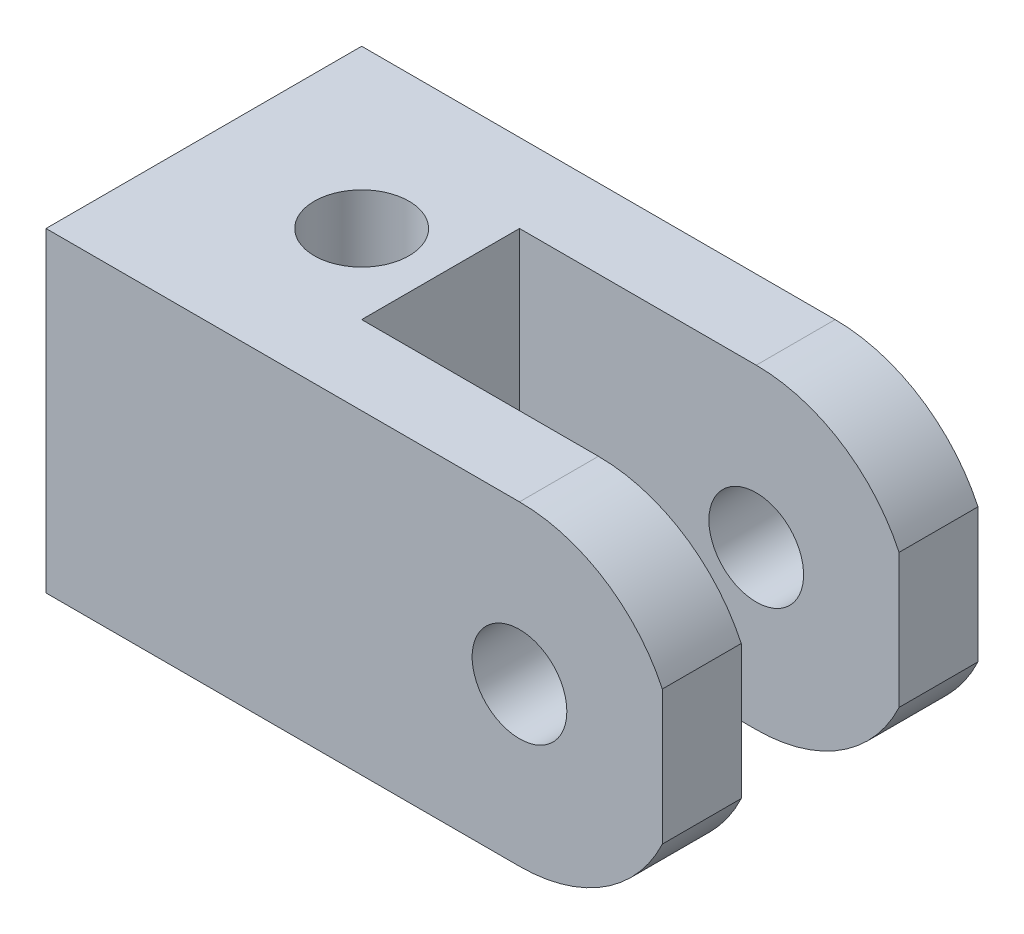
ISO-10303-21;
HEADER;
FILE_DESCRIPTION(('STEP AP214'),'2;1');
FILE_NAME('part.step','',(''),(''),'','','');
FILE_SCHEMA(('AUTOMOTIVE_DESIGN { 1 0 10303 214 1 1 1 1 }'));
ENDSEC;
DATA;
#1=APPLICATION_CONTEXT('core data for automotive mechanical design processes');
#2=APPLICATION_PROTOCOL_DEFINITION('international standard','automotive_design',2000,#1);
#3=PRODUCT_CONTEXT('',#1,'mechanical');
#4=PRODUCT('Part','Part','',(#3));
#5=PRODUCT_RELATED_PRODUCT_CATEGORY('part','',(#4));
#6=PRODUCT_DEFINITION_FORMATION('','',#4);
#7=PRODUCT_DEFINITION_CONTEXT('part definition',#1,'design');
#8=PRODUCT_DEFINITION('design','',#6,#7);
#9=PRODUCT_DEFINITION_SHAPE('','',#8);
#10=(LENGTH_UNIT() NAMED_UNIT(*) SI_UNIT(.MILLI.,.METRE.));
#11=(NAMED_UNIT(*) PLANE_ANGLE_UNIT() SI_UNIT($,.RADIAN.));
#12=(NAMED_UNIT(*) SI_UNIT($,.STERADIAN.) SOLID_ANGLE_UNIT());
#13=UNCERTAINTY_MEASURE_WITH_UNIT(LENGTH_MEASURE(1.E-05),#10,'distance_accuracy_value','');
#14=(GEOMETRIC_REPRESENTATION_CONTEXT(3) GLOBAL_UNCERTAINTY_ASSIGNED_CONTEXT((#13)) GLOBAL_UNIT_ASSIGNED_CONTEXT((#10,
#11,#12)) REPRESENTATION_CONTEXT('',''));
#15=CARTESIAN_POINT('',(0.,0.,0.));
#16=DIRECTION('',(0.,0.,1.));
#17=DIRECTION('',(1.,0.,0.));
#18=AXIS2_PLACEMENT_3D('',#15,#16,#17);
#19=CARTESIAN_POINT('',(5.,-5.,10.));
#20=DIRECTION('',(0.,1.,0.));
#21=DIRECTION('',(-1.,0.,0.));
#22=AXIS2_PLACEMENT_3D('',#19,#20,#21);
#23=PLANE('',#22);
#24=CARTESIAN_POINT('',(-10.,-5.,5.));
#25=DIRECTION('',(0.,1.,0.));
#26=DIRECTION('',(-1.,0.,0.));
#27=AXIS2_PLACEMENT_3D('',#24,#25,#26);
#28=CIRCLE('',#27,1.5);
#29=CARTESIAN_POINT('',(-11.5,-5.,5.));
#30=VERTEX_POINT('',#29);
#31=EDGE_CURVE('E196',#30,#30,#28,.T.);
#32=ORIENTED_EDGE('',*,*,#31,.T.);
#33=EDGE_LOOP('',(#32));
#34=FACE_BOUND('',#33,.T.);
#35=DIRECTION('',(0.,0.,1.));
#36=VECTOR('',#35,1.);
#37=CARTESIAN_POINT('',(0.,-5.,0.));
#38=LINE('',#37,#36);
#39=CARTESIAN_POINT('',(0.,-5.,7.5));
#40=VERTEX_POINT('',#39);
#41=CARTESIAN_POINT('',(0.,-5.,10.));
#42=VERTEX_POINT('',#41);
#43=EDGE_CURVE('E159',#40,#42,#38,.T.);
#44=ORIENTED_EDGE('',*,*,#43,.T.);
#45=DIRECTION('',(1.,0.,0.));
#46=VECTOR('',#45,1.);
#47=CARTESIAN_POINT('',(5.,-5.,10.));
#48=LINE('',#47,#46);
#49=CARTESIAN_POINT('',(-15.,-5.,10.));
#50=VERTEX_POINT('',#49);
#51=EDGE_CURVE('E210',#50,#42,#48,.T.);
#52=ORIENTED_EDGE('',*,*,#51,.F.);
#53=DIRECTION('',(0.,0.,-1.));
#54=VECTOR('',#53,1.);
#55=CARTESIAN_POINT('',(-15.,-5.,10.));
#56=LINE('',#55,#54);
#57=CARTESIAN_POINT('',(-15.,-5.,0.));
#58=VERTEX_POINT('',#57);
#59=EDGE_CURVE('E224',#50,#58,#56,.T.);
#60=ORIENTED_EDGE('',*,*,#59,.T.);
#61=DIRECTION('',(1.,0.,0.));
#62=VECTOR('',#61,1.);
#63=CARTESIAN_POINT('',(5.,-5.,0.));
#64=LINE('',#63,#62);
#65=CARTESIAN_POINT('',(0.,-5.,0.));
#66=VERTEX_POINT('',#65);
#67=EDGE_CURVE('E218',#58,#66,#64,.T.);
#68=ORIENTED_EDGE('',*,*,#67,.T.);
#69=CARTESIAN_POINT('',(0.,-5.,2.5));
#70=VERTEX_POINT('',#69);
#71=EDGE_CURVE('E156',#66,#70,#38,.T.);
#72=ORIENTED_EDGE('',*,*,#71,.T.);
#73=DIRECTION('',(1.,0.,0.));
#74=VECTOR('',#73,1.);
#75=CARTESIAN_POINT('',(-7.5,-5.,2.5));
#76=LINE('',#75,#74);
#77=CARTESIAN_POINT('',(-7.5,-5.,2.5));
#78=VERTEX_POINT('',#77);
#79=EDGE_CURVE('E188',#78,#70,#76,.T.);
#80=ORIENTED_EDGE('',*,*,#79,.F.);
#81=DIRECTION('',(0.,0.,-1.));
#82=VECTOR('',#81,1.);
#83=CARTESIAN_POINT('',(-7.5,-5.,7.5));
#84=LINE('',#83,#82);
#85=CARTESIAN_POINT('',(-7.5,-5.,7.5));
#86=VERTEX_POINT('',#85);
#87=EDGE_CURVE('E172',#86,#78,#84,.T.);
#88=ORIENTED_EDGE('',*,*,#87,.F.);
#89=DIRECTION('',(1.,0.,0.));
#90=VECTOR('',#89,1.);
#91=CARTESIAN_POINT('',(-7.5,-5.,7.5));
#92=LINE('',#91,#90);
#93=EDGE_CURVE('E180',#86,#40,#92,.T.);
#94=ORIENTED_EDGE('',*,*,#93,.T.);
#95=EDGE_LOOP('',(#44,#52,#60,#68,#72,#80,#88,#94));
#96=FACE_BOUND('',#95,.T.);
#97=ADVANCED_FACE('F33',(#34,#96),#23,.F.);
#98=CARTESIAN_POINT('',(0.,0.,10.));
#99=DIRECTION('',(0.,0.,-1.));
#100=DIRECTION('',(-1.,0.,0.));
#101=AXIS2_PLACEMENT_3D('',#98,#99,#100);
#102=CYLINDRICAL_SURFACE('',#101,1.5);
#103=CARTESIAN_POINT('',(0.,0.,7.5));
#104=DIRECTION('',(0.,0.,1.));
#105=DIRECTION('',(1.,0.,0.));
#106=AXIS2_PLACEMENT_3D('',#103,#104,#105);
#107=CIRCLE('',#106,1.5);
#108=CARTESIAN_POINT('',(1.5,0.,7.5));
#109=VERTEX_POINT('',#108);
#110=EDGE_CURVE('E197',#109,#109,#107,.T.);
#111=ORIENTED_EDGE('',*,*,#110,.F.);
#112=EDGE_LOOP('',(#111));
#113=FACE_BOUND('',#112,.T.);
#114=CARTESIAN_POINT('',(0.,0.,10.));
#115=DIRECTION('',(0.,0.,1.));
#116=DIRECTION('',(1.,0.,0.));
#117=AXIS2_PLACEMENT_3D('',#114,#115,#116);
#118=CIRCLE('',#117,1.5);
#119=CARTESIAN_POINT('',(1.5,0.,10.));
#120=VERTEX_POINT('',#119);
#121=EDGE_CURVE('E201',#120,#120,#118,.T.);
#122=ORIENTED_EDGE('',*,*,#121,.T.);
#123=EDGE_LOOP('',(#122));
#124=FACE_BOUND('',#123,.T.);
#125=ADVANCED_FACE('F279',(#113,#124),#102,.F.);
#126=CARTESIAN_POINT('',(0.,0.,10.));
#127=DIRECTION('',(0.,0.,1.));
#128=DIRECTION('',(1.,0.,0.));
#129=AXIS2_PLACEMENT_3D('',#126,#127,#128);
#130=PLANE('',#129);
#131=CARTESIAN_POINT('',(0.,0.,10.));
#132=DIRECTION('',(0.,0.,-1.));
#133=DIRECTION('',(1.,0.,0.));
#134=AXIS2_PLACEMENT_3D('',#131,#132,#133);
#135=CIRCLE('',#134,5.);
#136=CARTESIAN_POINT('',(0.,5.,10.));
#137=VERTEX_POINT('',#136);
#138=CARTESIAN_POINT('',(4.52508976466333,2.12686685566801,10.));
#139=VERTEX_POINT('',#138);
#140=EDGE_CURVE('E148',#137,#139,#135,.T.);
#141=ORIENTED_EDGE('',*,*,#140,.F.);
#142=DIRECTION('',(-1.,0.,0.));
#143=VECTOR('',#142,1.);
#144=CARTESIAN_POINT('',(5.,5.,10.));
#145=LINE('',#144,#143);
#146=CARTESIAN_POINT('',(-15.,5.,10.));
#147=VERTEX_POINT('',#146);
#148=EDGE_CURVE('E213',#137,#147,#145,.T.);
#149=ORIENTED_EDGE('',*,*,#148,.T.);
#150=DIRECTION('',(0.,-1.,0.));
#151=VECTOR('',#150,1.);
#152=CARTESIAN_POINT('',(-15.,-5.,10.));
#153=LINE('',#152,#151);
#154=EDGE_CURVE('E207',#147,#50,#153,.T.);
#155=ORIENTED_EDGE('',*,*,#154,.T.);
#156=ORIENTED_EDGE('',*,*,#51,.T.);
#157=CARTESIAN_POINT('',(0.,0.,10.));
#158=DIRECTION('',(0.,0.,-1.));
#159=DIRECTION('',(1.,0.,0.));
#160=AXIS2_PLACEMENT_3D('',#157,#158,#159);
#161=CIRCLE('',#160,5.);
#162=CARTESIAN_POINT('',(4.52508976466333,-2.12686685566801,10.));
#163=VERTEX_POINT('',#162);
#164=EDGE_CURVE('E142',#163,#42,#161,.T.);
#165=ORIENTED_EDGE('',*,*,#164,.F.);
#166=DIRECTION('',(0.,-1.,0.));
#167=VECTOR('',#166,1.);
#168=CARTESIAN_POINT('',(4.52508976466333,2.12686685566801,10.));
#169=LINE('',#168,#167);
#170=EDGE_CURVE('E144',#139,#163,#169,.T.);
#171=ORIENTED_EDGE('',*,*,#170,.F.);
#172=EDGE_LOOP('',(#141,#149,#155,#156,#165,#171));
#173=FACE_BOUND('',#172,.T.);
#174=ORIENTED_EDGE('',*,*,#121,.F.);
#175=EDGE_LOOP('',(#174));
#176=FACE_BOUND('',#175,.T.);
#177=ADVANCED_FACE('F264',(#173,#176),#130,.T.);
#178=CARTESIAN_POINT('',(0.,0.,0.));
#179=DIRECTION('',(0.,0.,1.));
#180=DIRECTION('',(1.,0.,0.));
#181=AXIS2_PLACEMENT_3D('',#178,#179,#180);
#182=PLANE('',#181);
#183=DIRECTION('',(-1.,0.,0.));
#184=VECTOR('',#183,1.);
#185=CARTESIAN_POINT('',(5.,5.,0.));
#186=LINE('',#185,#184);
#187=CARTESIAN_POINT('',(0.,5.,0.));
#188=VERTEX_POINT('',#187);
#189=CARTESIAN_POINT('',(-15.,5.,0.));
#190=VERTEX_POINT('',#189);
#191=EDGE_CURVE('E141',#188,#190,#186,.T.);
#192=ORIENTED_EDGE('',*,*,#191,.F.);
#193=CARTESIAN_POINT('',(0.,0.,0.));
#194=DIRECTION('',(0.,0.,-1.));
#195=DIRECTION('',(1.,0.,0.));
#196=AXIS2_PLACEMENT_3D('',#193,#194,#195);
#197=CIRCLE('',#196,5.);
#198=CARTESIAN_POINT('',(4.52508976466333,2.12686685566801,0.));
#199=VERTEX_POINT('',#198);
#200=EDGE_CURVE('E122',#188,#199,#197,.T.);
#201=ORIENTED_EDGE('',*,*,#200,.T.);
#202=DIRECTION('',(0.,-1.,0.));
#203=VECTOR('',#202,1.);
#204=CARTESIAN_POINT('',(4.52508976466333,2.12686685566801,0.));
#205=LINE('',#204,#203);
#206=CARTESIAN_POINT('',(4.52508976466333,-2.12686685566801,0.));
#207=VERTEX_POINT('',#206);
#208=EDGE_CURVE('E128',#199,#207,#205,.T.);
#209=ORIENTED_EDGE('',*,*,#208,.T.);
#210=CARTESIAN_POINT('',(0.,0.,0.));
#211=DIRECTION('',(0.,0.,-1.));
#212=DIRECTION('',(1.,0.,0.));
#213=AXIS2_PLACEMENT_3D('',#210,#211,#212);
#214=CIRCLE('',#213,5.);
#215=EDGE_CURVE('E135',#207,#66,#214,.T.);
#216=ORIENTED_EDGE('',*,*,#215,.T.);
#217=ORIENTED_EDGE('',*,*,#67,.F.);
#218=DIRECTION('',(0.,-1.,0.));
#219=VECTOR('',#218,1.);
#220=CARTESIAN_POINT('',(-15.,-5.,0.));
#221=LINE('',#220,#219);
#222=EDGE_CURVE('E204',#190,#58,#221,.T.);
#223=ORIENTED_EDGE('',*,*,#222,.F.);
#224=EDGE_LOOP('',(#192,#201,#209,#216,#217,#223));
#225=FACE_BOUND('',#224,.T.);
#226=CARTESIAN_POINT('',(0.,0.,0.));
#227=DIRECTION('',(0.,0.,1.));
#228=DIRECTION('',(1.,0.,0.));
#229=AXIS2_PLACEMENT_3D('',#226,#227,#228);
#230=CIRCLE('',#229,1.5);
#231=CARTESIAN_POINT('',(1.5,0.,0.));
#232=VERTEX_POINT('',#231);
#233=EDGE_CURVE('E200',#232,#232,#230,.T.);
#234=ORIENTED_EDGE('',*,*,#233,.T.);
#235=EDGE_LOOP('',(#234));
#236=FACE_BOUND('',#235,.T.);
#237=ADVANCED_FACE('F138',(#225,#236),#182,.F.);
#238=CARTESIAN_POINT('',(-15.,-5.,10.));
#239=DIRECTION('',(1.,0.,0.));
#240=DIRECTION('',(0.,0.,-1.));
#241=AXIS2_PLACEMENT_3D('',#238,#239,#240);
#242=PLANE('',#241);
#243=ORIENTED_EDGE('',*,*,#222,.T.);
#244=ORIENTED_EDGE('',*,*,#59,.F.);
#245=ORIENTED_EDGE('',*,*,#154,.F.);
#246=DIRECTION('',(0.,0.,-1.));
#247=VECTOR('',#246,1.);
#248=CARTESIAN_POINT('',(-15.,5.,10.));
#249=LINE('',#248,#247);
#250=EDGE_CURVE('E215',#147,#190,#249,.T.);
#251=ORIENTED_EDGE('',*,*,#250,.T.);
#252=EDGE_LOOP('',(#243,#244,#245,#251));
#253=FACE_BOUND('',#252,.T.);
#254=ADVANCED_FACE('F35',(#253),#242,.F.);
#255=CARTESIAN_POINT('',(5.,5.,10.));
#256=DIRECTION('',(0.,-1.,0.));
#257=DIRECTION('',(1.,0.,0.));
#258=AXIS2_PLACEMENT_3D('',#255,#256,#257);
#259=PLANE('',#258);
#260=ORIENTED_EDGE('',*,*,#148,.F.);
#261=DIRECTION('',(0.,0.,1.));
#262=VECTOR('',#261,1.);
#263=CARTESIAN_POINT('',(0.,5.,0.));
#264=LINE('',#263,#262);
#265=CARTESIAN_POINT('',(0.,5.,7.5));
#266=VERTEX_POINT('',#265);
#267=EDGE_CURVE('E155',#266,#137,#264,.T.);
#268=ORIENTED_EDGE('',*,*,#267,.F.);
#269=DIRECTION('',(1.,0.,0.));
#270=VECTOR('',#269,1.);
#271=CARTESIAN_POINT('',(-7.5,5.,7.5));
#272=LINE('',#271,#270);
#273=CARTESIAN_POINT('',(-7.5,5.,7.5));
#274=VERTEX_POINT('',#273);
#275=EDGE_CURVE('E181',#274,#266,#272,.T.);
#276=ORIENTED_EDGE('',*,*,#275,.F.);
#277=DIRECTION('',(0.,0.,1.));
#278=VECTOR('',#277,1.);
#279=CARTESIAN_POINT('',(-7.5,5.,7.5));
#280=LINE('',#279,#278);
#281=CARTESIAN_POINT('',(-7.5,5.,2.5));
#282=VERTEX_POINT('',#281);
#283=EDGE_CURVE('E177',#282,#274,#280,.T.);
#284=ORIENTED_EDGE('',*,*,#283,.F.);
#285=DIRECTION('',(1.,0.,0.));
#286=VECTOR('',#285,1.);
#287=CARTESIAN_POINT('',(-7.5,5.,2.5));
#288=LINE('',#287,#286);
#289=CARTESIAN_POINT('',(0.,5.,2.5));
#290=VERTEX_POINT('',#289);
#291=EDGE_CURVE('E185',#282,#290,#288,.T.);
#292=ORIENTED_EDGE('',*,*,#291,.T.);
#293=EDGE_CURVE('E152',#188,#290,#264,.T.);
#294=ORIENTED_EDGE('',*,*,#293,.F.);
#295=ORIENTED_EDGE('',*,*,#191,.T.);
#296=ORIENTED_EDGE('',*,*,#250,.F.);
#297=EDGE_LOOP('',(#260,#268,#276,#284,#292,#294,#295,#296));
#298=FACE_BOUND('',#297,.T.);
#299=CARTESIAN_POINT('',(-10.,5.,5.));
#300=DIRECTION('',(0.,1.,0.));
#301=DIRECTION('',(-1.,0.,0.));
#302=AXIS2_PLACEMENT_3D('',#299,#300,#301);
#303=CIRCLE('',#302,1.5);
#304=CARTESIAN_POINT('',(-11.5,5.,5.));
#305=VERTEX_POINT('',#304);
#306=EDGE_CURVE('E193',#305,#305,#303,.T.);
#307=ORIENTED_EDGE('',*,*,#306,.F.);
#308=EDGE_LOOP('',(#307));
#309=FACE_BOUND('',#308,.T.);
#310=ADVANCED_FACE('F247',(#298,#309),#259,.F.);
#311=CARTESIAN_POINT('',(0.,0.,2.5));
#312=DIRECTION('',(0.,0.,-1.));
#313=DIRECTION('',(-1.,0.,0.));
#314=AXIS2_PLACEMENT_3D('',#311,#312,#313);
#315=CIRCLE('',#314,1.5);
#316=CARTESIAN_POINT('',(-1.5,0.,2.5));
#317=VERTEX_POINT('',#316);
#318=EDGE_CURVE('E184',#317,#317,#315,.T.);
#319=ORIENTED_EDGE('',*,*,#318,.F.);
#320=EDGE_LOOP('',(#319));
#321=FACE_BOUND('',#320,.T.);
#322=ORIENTED_EDGE('',*,*,#233,.F.);
#323=EDGE_LOOP('',(#322));
#324=FACE_BOUND('',#323,.T.);
#325=ADVANCED_FACE('F286',(#321,#324),#102,.F.);
#326=CARTESIAN_POINT('',(-10.,-9.00000000000001,5.));
#327=DIRECTION('',(0.,1.,0.));
#328=DIRECTION('',(-1.,0.,0.));
#329=AXIS2_PLACEMENT_3D('',#326,#327,#328);
#330=CYLINDRICAL_SURFACE('',#329,1.5);
#331=ORIENTED_EDGE('',*,*,#306,.T.);
#332=EDGE_LOOP('',(#331));
#333=FACE_BOUND('',#332,.T.);
#334=ORIENTED_EDGE('',*,*,#31,.F.);
#335=EDGE_LOOP('',(#334));
#336=FACE_BOUND('',#335,.T.);
#337=ADVANCED_FACE('F295',(#333,#336),#330,.F.);
#338=CARTESIAN_POINT('',(-7.5,-5.,7.5));
#339=DIRECTION('',(0.,0.,1.));
#340=DIRECTION('',(1.,0.,0.));
#341=AXIS2_PLACEMENT_3D('',#338,#339,#340);
#342=PLANE('',#341);
#343=ORIENTED_EDGE('',*,*,#275,.T.);
#344=CARTESIAN_POINT('',(0.,0.,7.5));
#345=DIRECTION('',(0.,0.,1.));
#346=DIRECTION('',(1.,0.,0.));
#347=AXIS2_PLACEMENT_3D('',#344,#345,#346);
#348=CIRCLE('',#347,5.);
#349=CARTESIAN_POINT('',(4.52508976466333,2.12686685566801,7.5));
#350=VERTEX_POINT('',#349);
#351=EDGE_CURVE('E166',#266,#350,#348,.F.);
#352=ORIENTED_EDGE('',*,*,#351,.T.);
#353=DIRECTION('',(0.,-1.,0.));
#354=VECTOR('',#353,1.);
#355=CARTESIAN_POINT('',(4.52508976466333,-5.,7.5));
#356=LINE('',#355,#354);
#357=CARTESIAN_POINT('',(4.52508976466333,-2.12686685566801,7.5));
#358=VERTEX_POINT('',#357);
#359=EDGE_CURVE('E154',#350,#358,#356,.T.);
#360=ORIENTED_EDGE('',*,*,#359,.T.);
#361=CARTESIAN_POINT('',(0.,0.,7.5));
#362=DIRECTION('',(0.,0.,1.));
#363=DIRECTION('',(1.,0.,0.));
#364=AXIS2_PLACEMENT_3D('',#361,#362,#363);
#365=CIRCLE('',#364,5.);
#366=EDGE_CURVE('E163',#358,#40,#365,.F.);
#367=ORIENTED_EDGE('',*,*,#366,.T.);
#368=ORIENTED_EDGE('',*,*,#93,.F.);
#369=DIRECTION('',(0.,-1.,0.));
#370=VECTOR('',#369,1.);
#371=CARTESIAN_POINT('',(-7.5,-5.,7.5));
#372=LINE('',#371,#370);
#373=EDGE_CURVE('E169',#274,#86,#372,.T.);
#374=ORIENTED_EDGE('',*,*,#373,.F.);
#375=EDGE_LOOP('',(#343,#352,#360,#367,#368,#374));
#376=FACE_BOUND('',#375,.T.);
#377=ORIENTED_EDGE('',*,*,#110,.T.);
#378=EDGE_LOOP('',(#377));
#379=FACE_BOUND('',#378,.T.);
#380=ADVANCED_FACE('F256',(#376,#379),#342,.F.);
#381=CARTESIAN_POINT('',(-7.5,-5.,2.5));
#382=DIRECTION('',(0.,0.,-1.));
#383=DIRECTION('',(-1.,0.,0.));
#384=AXIS2_PLACEMENT_3D('',#381,#382,#383);
#385=PLANE('',#384);
#386=ORIENTED_EDGE('',*,*,#318,.T.);
#387=EDGE_LOOP('',(#386));
#388=FACE_BOUND('',#387,.T.);
#389=DIRECTION('',(0.,1.,0.));
#390=VECTOR('',#389,1.);
#391=CARTESIAN_POINT('',(4.52508976466333,-5.,2.5));
#392=LINE('',#391,#390);
#393=CARTESIAN_POINT('',(4.52508976466333,-2.12686685566801,2.5));
#394=VERTEX_POINT('',#393);
#395=CARTESIAN_POINT('',(4.52508976466333,2.12686685566801,2.5));
#396=VERTEX_POINT('',#395);
#397=EDGE_CURVE('E227',#394,#396,#392,.T.);
#398=ORIENTED_EDGE('',*,*,#397,.T.);
#399=CARTESIAN_POINT('',(0.,0.,2.5));
#400=DIRECTION('',(0.,0.,-1.));
#401=DIRECTION('',(-1.,0.,0.));
#402=AXIS2_PLACEMENT_3D('',#399,#400,#401);
#403=CIRCLE('',#402,5.);
#404=EDGE_CURVE('E11',#396,#290,#403,.F.);
#405=ORIENTED_EDGE('',*,*,#404,.T.);
#406=ORIENTED_EDGE('',*,*,#291,.F.);
#407=DIRECTION('',(0.,1.,0.));
#408=VECTOR('',#407,1.);
#409=CARTESIAN_POINT('',(-7.5,-5.,2.5));
#410=LINE('',#409,#408);
#411=EDGE_CURVE('E175',#78,#282,#410,.T.);
#412=ORIENTED_EDGE('',*,*,#411,.F.);
#413=ORIENTED_EDGE('',*,*,#79,.T.);
#414=CARTESIAN_POINT('',(0.,0.,2.5));
#415=DIRECTION('',(0.,0.,-1.));
#416=DIRECTION('',(-1.,0.,0.));
#417=AXIS2_PLACEMENT_3D('',#414,#415,#416);
#418=CIRCLE('',#417,5.);
#419=EDGE_CURVE('E41',#70,#394,#418,.F.);
#420=ORIENTED_EDGE('',*,*,#419,.T.);
#421=EDGE_LOOP('',(#398,#405,#406,#412,#413,#420));
#422=FACE_BOUND('',#421,.T.);
#423=ADVANCED_FACE('F234',(#388,#422),#385,.F.);
#424=CARTESIAN_POINT('',(-7.5,0.,0.));
#425=DIRECTION('',(-1.,0.,0.));
#426=DIRECTION('',(0.,0.,1.));
#427=AXIS2_PLACEMENT_3D('',#424,#425,#426);
#428=PLANE('',#427);
#429=ORIENTED_EDGE('',*,*,#373,.T.);
#430=ORIENTED_EDGE('',*,*,#87,.T.);
#431=ORIENTED_EDGE('',*,*,#411,.T.);
#432=ORIENTED_EDGE('',*,*,#283,.T.);
#433=EDGE_LOOP('',(#429,#430,#431,#432));
#434=FACE_BOUND('',#433,.T.);
#435=ADVANCED_FACE('F254',(#434),#428,.F.);
#436=CARTESIAN_POINT('',(4.52508976466333,2.12686685566801,0.));
#437=DIRECTION('',(-1.,0.,0.));
#438=DIRECTION('',(0.,0.,1.));
#439=AXIS2_PLACEMENT_3D('',#436,#437,#438);
#440=PLANE('',#439);
#441=DIRECTION('',(0.,0.,1.));
#442=VECTOR('',#441,1.);
#443=CARTESIAN_POINT('',(4.52508976466333,-2.12686685566801,0.));
#444=LINE('',#443,#442);
#445=EDGE_CURVE('E131',#207,#394,#444,.T.);
#446=ORIENTED_EDGE('',*,*,#445,.F.);
#447=ORIENTED_EDGE('',*,*,#208,.F.);
#448=DIRECTION('',(0.,0.,1.));
#449=VECTOR('',#448,1.);
#450=CARTESIAN_POINT('',(4.52508976466333,2.12686685566801,0.));
#451=LINE('',#450,#449);
#452=EDGE_CURVE('E56',#199,#396,#451,.T.);
#453=ORIENTED_EDGE('',*,*,#452,.T.);
#454=ORIENTED_EDGE('',*,*,#397,.F.);
#455=EDGE_LOOP('',(#446,#447,#453,#454));
#456=FACE_BOUND('',#455,.T.);
#457=ADVANCED_FACE('F129',(#456),#440,.F.);
#458=CARTESIAN_POINT('',(0.,0.,0.));
#459=DIRECTION('',(0.,0.,1.));
#460=DIRECTION('',(1.,0.,0.));
#461=AXIS2_PLACEMENT_3D('',#458,#459,#460);
#462=CYLINDRICAL_SURFACE('',#461,5.);
#463=ORIENTED_EDGE('',*,*,#71,.F.);
#464=ORIENTED_EDGE('',*,*,#215,.F.);
#465=ORIENTED_EDGE('',*,*,#445,.T.);
#466=ORIENTED_EDGE('',*,*,#419,.F.);
#467=EDGE_LOOP('',(#463,#464,#465,#466));
#468=FACE_BOUND('',#467,.T.);
#469=ADVANCED_FACE('F237',(#468),#462,.T.);
#470=CARTESIAN_POINT('',(0.,0.,0.));
#471=DIRECTION('',(0.,0.,1.));
#472=DIRECTION('',(1.,0.,0.));
#473=AXIS2_PLACEMENT_3D('',#470,#471,#472);
#474=CYLINDRICAL_SURFACE('',#473,5.);
#475=ORIENTED_EDGE('',*,*,#452,.F.);
#476=ORIENTED_EDGE('',*,*,#200,.F.);
#477=ORIENTED_EDGE('',*,*,#293,.T.);
#478=ORIENTED_EDGE('',*,*,#404,.F.);
#479=EDGE_LOOP('',(#475,#476,#477,#478));
#480=FACE_BOUND('',#479,.T.);
#481=ADVANCED_FACE('F120',(#480),#474,.T.);
#482=ORIENTED_EDGE('',*,*,#267,.T.);
#483=ORIENTED_EDGE('',*,*,#140,.T.);
#484=EDGE_CURVE('E125',#350,#139,#451,.T.);
#485=ORIENTED_EDGE('',*,*,#484,.F.);
#486=ORIENTED_EDGE('',*,*,#351,.F.);
#487=EDGE_LOOP('',(#482,#483,#485,#486));
#488=FACE_BOUND('',#487,.T.);
#489=ADVANCED_FACE('F268',(#488),#474,.T.);
#490=EDGE_CURVE('E48',#358,#163,#444,.T.);
#491=ORIENTED_EDGE('',*,*,#490,.T.);
#492=ORIENTED_EDGE('',*,*,#164,.T.);
#493=ORIENTED_EDGE('',*,*,#43,.F.);
#494=ORIENTED_EDGE('',*,*,#366,.F.);
#495=EDGE_LOOP('',(#491,#492,#493,#494));
#496=FACE_BOUND('',#495,.T.);
#497=ADVANCED_FACE('F259',(#496),#462,.T.);
#498=ORIENTED_EDGE('',*,*,#484,.T.);
#499=ORIENTED_EDGE('',*,*,#170,.T.);
#500=ORIENTED_EDGE('',*,*,#490,.F.);
#501=ORIENTED_EDGE('',*,*,#359,.F.);
#502=EDGE_LOOP('',(#498,#499,#500,#501));
#503=FACE_BOUND('',#502,.T.);
#504=ADVANCED_FACE('F269',(#503),#440,.F.);
#505=CLOSED_SHELL('',(#97,#125,#177,#237,#254,#310,#325,#337,#380,#423,#435,#457,#469,#481,#489,
#497,#504));
#506=MANIFOLD_SOLID_BREP('B2',#505);
#507=ADVANCED_BREP_SHAPE_REPRESENTATION('',(#18,#506),#14);
#508=SHAPE_DEFINITION_REPRESENTATION(#9,#507);
ENDSEC;
END-ISO-10303-21;
